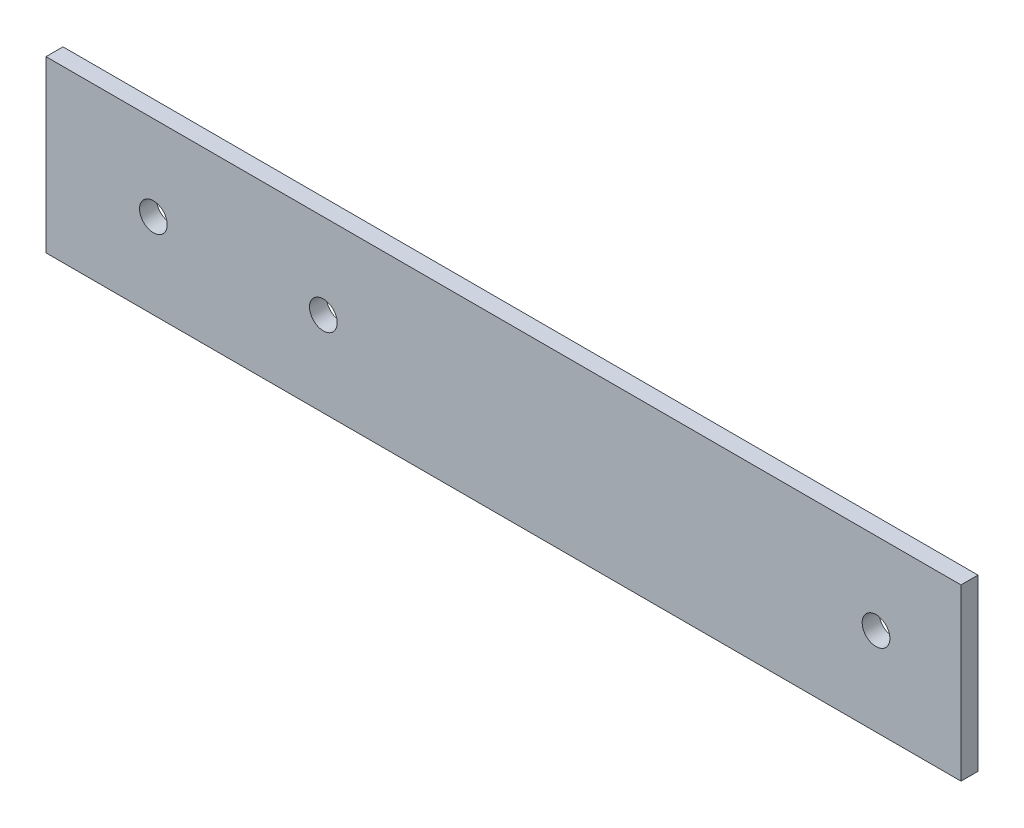
ISO-10303-21;
HEADER;
FILE_DESCRIPTION(('STEP AP214'),'2;1');
FILE_NAME('part.step','',(''),(''),'','','');
FILE_SCHEMA(('AUTOMOTIVE_DESIGN { 1 0 10303 214 1 1 1 1 }'));
ENDSEC;
DATA;
#1=APPLICATION_CONTEXT('core data for automotive mechanical design processes');
#2=APPLICATION_PROTOCOL_DEFINITION('international standard','automotive_design',2000,#1);
#3=PRODUCT_CONTEXT('',#1,'mechanical');
#4=PRODUCT('Part','Part','',(#3));
#5=PRODUCT_RELATED_PRODUCT_CATEGORY('part','',(#4));
#6=PRODUCT_DEFINITION_FORMATION('','',#4);
#7=PRODUCT_DEFINITION_CONTEXT('part definition',#1,'design');
#8=PRODUCT_DEFINITION('design','',#6,#7);
#9=PRODUCT_DEFINITION_SHAPE('','',#8);
#10=(LENGTH_UNIT() NAMED_UNIT(*) SI_UNIT(.MILLI.,.METRE.));
#11=(NAMED_UNIT(*) PLANE_ANGLE_UNIT() SI_UNIT($,.RADIAN.));
#12=(NAMED_UNIT(*) SI_UNIT($,.STERADIAN.) SOLID_ANGLE_UNIT());
#13=UNCERTAINTY_MEASURE_WITH_UNIT(LENGTH_MEASURE(1.E-05),#10,'distance_accuracy_value','');
#14=(GEOMETRIC_REPRESENTATION_CONTEXT(3) GLOBAL_UNCERTAINTY_ASSIGNED_CONTEXT((#13)) GLOBAL_UNIT_ASSIGNED_CONTEXT((#10,
#11,#12)) REPRESENTATION_CONTEXT('',''));
#15=CARTESIAN_POINT('',(0.,0.,0.));
#16=DIRECTION('',(0.,0.,1.));
#17=DIRECTION('',(1.,0.,0.));
#18=AXIS2_PLACEMENT_3D('',#15,#16,#17);
#19=CARTESIAN_POINT('',(0.,0.,2.54));
#20=DIRECTION('',(0.,0.,-1.));
#21=DIRECTION('',(-1.,0.,0.));
#22=AXIS2_PLACEMENT_3D('',#19,#20,#21);
#23=PLANE('',#22);
#24=DIRECTION('',(-1.,0.,0.));
#25=VECTOR('',#24,1.);
#26=CARTESIAN_POINT('',(-118.938398372896,202.301133888924,2.54));
#27=LINE('',#26,#25);
#28=CARTESIAN_POINT('',(17.7896282413869,202.301133888924,2.54));
#29=VERTEX_POINT('',#28);
#30=CARTESIAN_POINT('',(-118.938398372896,202.301133888924,2.54));
#31=VERTEX_POINT('',#30);
#32=EDGE_CURVE('E85',#29,#31,#27,.T.);
#33=ORIENTED_EDGE('',*,*,#32,.T.);
#34=DIRECTION('',(0.,-1.,0.));
#35=VECTOR('',#34,1.);
#36=CARTESIAN_POINT('',(-118.938398372896,176.901133888924,2.54));
#37=LINE('',#36,#35);
#38=CARTESIAN_POINT('',(-118.938398372896,176.901133888924,2.54));
#39=VERTEX_POINT('',#38);
#40=EDGE_CURVE('E80',#31,#39,#37,.T.);
#41=ORIENTED_EDGE('',*,*,#40,.T.);
#42=DIRECTION('',(1.,0.,0.));
#43=VECTOR('',#42,1.);
#44=CARTESIAN_POINT('',(17.7896282413869,176.901133888924,2.54));
#45=LINE('',#44,#43);
#46=CARTESIAN_POINT('',(17.7896282413869,176.901133888924,2.54));
#47=VERTEX_POINT('',#46);
#48=EDGE_CURVE('E83',#39,#47,#45,.T.);
#49=ORIENTED_EDGE('',*,*,#48,.T.);
#50=DIRECTION('',(0.,1.,0.));
#51=VECTOR('',#50,1.);
#52=CARTESIAN_POINT('',(17.7896282413869,202.301133888924,2.54));
#53=LINE('',#52,#51);
#54=EDGE_CURVE('E50',#47,#29,#53,.T.);
#55=ORIENTED_EDGE('',*,*,#54,.T.);
#56=EDGE_LOOP('',(#33,#41,#49,#55));
#57=FACE_BOUND('',#56,.T.);
#58=CARTESIAN_POINT('',(5.0896273733908,190.042706089712,2.54));
#59=DIRECTION('',(0.,0.,1.));
#60=DIRECTION('',(1.,0.,0.));
#61=AXIS2_PLACEMENT_3D('',#58,#59,#60);
#62=CIRCLE('',#61,2.07009999999997);
#63=CARTESIAN_POINT('',(7.15972737339078,190.042706089712,2.54));
#64=VERTEX_POINT('',#63);
#65=EDGE_CURVE('E100',#64,#64,#62,.T.);
#66=ORIENTED_EDGE('',*,*,#65,.F.);
#67=EDGE_LOOP('',(#66));
#68=FACE_BOUND('',#67,.T.);
#69=CARTESIAN_POINT('',(-77.4929304558526,189.601133897075,2.54));
#70=DIRECTION('',(0.,0.,1.));
#71=DIRECTION('',(1.,0.,0.));
#72=AXIS2_PLACEMENT_3D('',#69,#70,#71);
#73=CIRCLE('',#72,2.07009999999998);
#74=CARTESIAN_POINT('',(-75.4228304558527,189.601133897075,2.54));
#75=VERTEX_POINT('',#74);
#76=EDGE_CURVE('E115',#75,#75,#73,.T.);
#77=ORIENTED_EDGE('',*,*,#76,.F.);
#78=EDGE_LOOP('',(#77));
#79=FACE_BOUND('',#78,.T.);
#80=CARTESIAN_POINT('',(-102.892930455853,189.601133897059,2.54));
#81=DIRECTION('',(0.,0.,1.));
#82=DIRECTION('',(1.,0.,0.));
#83=AXIS2_PLACEMENT_3D('',#80,#81,#82);
#84=CIRCLE('',#83,2.07009999999998);
#85=CARTESIAN_POINT('',(-100.822830455853,189.601133897059,2.54));
#86=VERTEX_POINT('',#85);
#87=EDGE_CURVE('E121',#86,#86,#84,.T.);
#88=ORIENTED_EDGE('',*,*,#87,.F.);
#89=EDGE_LOOP('',(#88));
#90=FACE_BOUND('',#89,.T.);
#91=ADVANCED_FACE('F33',(#57,#68,#79,#90),#23,.F.);
#92=CARTESIAN_POINT('',(0.,0.,0.));
#93=DIRECTION('',(0.,0.,-1.));
#94=DIRECTION('',(-1.,0.,0.));
#95=AXIS2_PLACEMENT_3D('',#92,#93,#94);
#96=PLANE('',#95);
#97=CARTESIAN_POINT('',(-77.4929304558526,189.601133897075,0.));
#98=DIRECTION('',(0.,0.,1.));
#99=DIRECTION('',(1.,0.,0.));
#100=AXIS2_PLACEMENT_3D('',#97,#98,#99);
#101=CIRCLE('',#100,2.07009999999998);
#102=CARTESIAN_POINT('',(-75.4228304558527,189.601133897075,0.));
#103=VERTEX_POINT('',#102);
#104=EDGE_CURVE('E118',#103,#103,#101,.T.);
#105=ORIENTED_EDGE('',*,*,#104,.T.);
#106=EDGE_LOOP('',(#105));
#107=FACE_BOUND('',#106,.T.);
#108=DIRECTION('',(-1.,0.,0.));
#109=VECTOR('',#108,1.);
#110=CARTESIAN_POINT('',(-118.938398372896,202.301133888924,0.));
#111=LINE('',#110,#109);
#112=CARTESIAN_POINT('',(17.7896282413869,202.301133888924,0.));
#113=VERTEX_POINT('',#112);
#114=CARTESIAN_POINT('',(-118.938398372896,202.301133888924,0.));
#115=VERTEX_POINT('',#114);
#116=EDGE_CURVE('E97',#113,#115,#111,.T.);
#117=ORIENTED_EDGE('',*,*,#116,.F.);
#118=DIRECTION('',(0.,1.,0.));
#119=VECTOR('',#118,1.);
#120=CARTESIAN_POINT('',(17.7896282413869,202.301133888924,0.));
#121=LINE('',#120,#119);
#122=CARTESIAN_POINT('',(17.7896282413869,176.901133888924,0.));
#123=VERTEX_POINT('',#122);
#124=EDGE_CURVE('E73',#123,#113,#121,.T.);
#125=ORIENTED_EDGE('',*,*,#124,.F.);
#126=DIRECTION('',(1.,0.,0.));
#127=VECTOR('',#126,1.);
#128=CARTESIAN_POINT('',(17.7896282413869,176.901133888924,0.));
#129=LINE('',#128,#127);
#130=CARTESIAN_POINT('',(-118.938398372896,176.901133888924,0.));
#131=VERTEX_POINT('',#130);
#132=EDGE_CURVE('E67',#131,#123,#129,.T.);
#133=ORIENTED_EDGE('',*,*,#132,.F.);
#134=DIRECTION('',(0.,-1.,0.));
#135=VECTOR('',#134,1.);
#136=CARTESIAN_POINT('',(-118.938398372896,176.901133888924,0.));
#137=LINE('',#136,#135);
#138=EDGE_CURVE('E89',#115,#131,#137,.T.);
#139=ORIENTED_EDGE('',*,*,#138,.F.);
#140=EDGE_LOOP('',(#117,#125,#133,#139));
#141=FACE_BOUND('',#140,.T.);
#142=CARTESIAN_POINT('',(5.0896273733908,190.042706089712,0.));
#143=DIRECTION('',(0.,0.,1.));
#144=DIRECTION('',(1.,0.,0.));
#145=AXIS2_PLACEMENT_3D('',#142,#143,#144);
#146=CIRCLE('',#145,2.07009999999997);
#147=CARTESIAN_POINT('',(7.15972737339078,190.042706089712,0.));
#148=VERTEX_POINT('',#147);
#149=EDGE_CURVE('E112',#148,#148,#146,.T.);
#150=ORIENTED_EDGE('',*,*,#149,.T.);
#151=EDGE_LOOP('',(#150));
#152=FACE_BOUND('',#151,.T.);
#153=CARTESIAN_POINT('',(-102.892930455853,189.601133897059,0.));
#154=DIRECTION('',(0.,0.,1.));
#155=DIRECTION('',(1.,0.,0.));
#156=AXIS2_PLACEMENT_3D('',#153,#154,#155);
#157=CIRCLE('',#156,2.07009999999998);
#158=CARTESIAN_POINT('',(-100.822830455853,189.601133897059,0.));
#159=VERTEX_POINT('',#158);
#160=EDGE_CURVE('E124',#159,#159,#157,.T.);
#161=ORIENTED_EDGE('',*,*,#160,.T.);
#162=EDGE_LOOP('',(#161));
#163=FACE_BOUND('',#162,.T.);
#164=ADVANCED_FACE('F108',(#107,#141,#152,#163),#96,.T.);
#165=CARTESIAN_POINT('',(-118.938398372896,202.301133888924,2.54));
#166=DIRECTION('',(0.,-1.,0.));
#167=DIRECTION('',(0.,0.,-1.));
#168=AXIS2_PLACEMENT_3D('',#165,#166,#167);
#169=PLANE('',#168);
#170=ORIENTED_EDGE('',*,*,#116,.T.);
#171=DIRECTION('',(0.,0.,-1.));
#172=VECTOR('',#171,1.);
#173=CARTESIAN_POINT('',(-118.938398372896,202.301133888924,2.54));
#174=LINE('',#173,#172);
#175=EDGE_CURVE('E11',#31,#115,#174,.T.);
#176=ORIENTED_EDGE('',*,*,#175,.F.);
#177=ORIENTED_EDGE('',*,*,#32,.F.);
#178=DIRECTION('',(0.,0.,-1.));
#179=VECTOR('',#178,1.);
#180=CARTESIAN_POINT('',(17.7896282413869,202.301133888924,2.54));
#181=LINE('',#180,#179);
#182=EDGE_CURVE('E93',#29,#113,#181,.T.);
#183=ORIENTED_EDGE('',*,*,#182,.T.);
#184=EDGE_LOOP('',(#170,#176,#177,#183));
#185=FACE_BOUND('',#184,.T.);
#186=ADVANCED_FACE('F35',(#185),#169,.F.);
#187=CARTESIAN_POINT('',(-118.938398372896,176.901133888924,2.54));
#188=DIRECTION('',(1.,0.,0.));
#189=DIRECTION('',(0.,1.,0.));
#190=AXIS2_PLACEMENT_3D('',#187,#188,#189);
#191=PLANE('',#190);
#192=ORIENTED_EDGE('',*,*,#138,.T.);
#193=DIRECTION('',(0.,0.,-1.));
#194=VECTOR('',#193,1.);
#195=CARTESIAN_POINT('',(-118.938398372896,176.901133888924,2.54));
#196=LINE('',#195,#194);
#197=EDGE_CURVE('E42',#39,#131,#196,.T.);
#198=ORIENTED_EDGE('',*,*,#197,.F.);
#199=ORIENTED_EDGE('',*,*,#40,.F.);
#200=ORIENTED_EDGE('',*,*,#175,.T.);
#201=EDGE_LOOP('',(#192,#198,#199,#200));
#202=FACE_BOUND('',#201,.T.);
#203=ADVANCED_FACE('F88',(#202),#191,.F.);
#204=CARTESIAN_POINT('',(17.7896282413869,176.901133888924,2.54));
#205=DIRECTION('',(0.,1.,0.));
#206=DIRECTION('',(-1.,0.,0.));
#207=AXIS2_PLACEMENT_3D('',#204,#205,#206);
#208=PLANE('',#207);
#209=ORIENTED_EDGE('',*,*,#132,.T.);
#210=DIRECTION('',(0.,0.,-1.));
#211=VECTOR('',#210,1.);
#212=CARTESIAN_POINT('',(17.7896282413869,176.901133888924,2.54));
#213=LINE('',#212,#211);
#214=EDGE_CURVE('E90',#47,#123,#213,.T.);
#215=ORIENTED_EDGE('',*,*,#214,.F.);
#216=ORIENTED_EDGE('',*,*,#48,.F.);
#217=ORIENTED_EDGE('',*,*,#197,.T.);
#218=EDGE_LOOP('',(#209,#215,#216,#217));
#219=FACE_BOUND('',#218,.T.);
#220=ADVANCED_FACE('F91',(#219),#208,.F.);
#221=CARTESIAN_POINT('',(17.7896282413869,202.301133888924,2.54));
#222=DIRECTION('',(-1.,0.,0.));
#223=DIRECTION('',(0.,-1.,0.));
#224=AXIS2_PLACEMENT_3D('',#221,#222,#223);
#225=PLANE('',#224);
#226=ORIENTED_EDGE('',*,*,#124,.T.);
#227=ORIENTED_EDGE('',*,*,#182,.F.);
#228=ORIENTED_EDGE('',*,*,#54,.F.);
#229=ORIENTED_EDGE('',*,*,#214,.T.);
#230=EDGE_LOOP('',(#226,#227,#228,#229));
#231=FACE_BOUND('',#230,.T.);
#232=ADVANCED_FACE('F105',(#231),#225,.F.);
#233=CARTESIAN_POINT('',(5.0896273733908,190.042706089712,2.54));
#234=DIRECTION('',(0.,0.,-1.));
#235=DIRECTION('',(-1.,0.,0.));
#236=AXIS2_PLACEMENT_3D('',#233,#234,#235);
#237=CYLINDRICAL_SURFACE('',#236,2.07009999999997);
#238=ORIENTED_EDGE('',*,*,#65,.T.);
#239=EDGE_LOOP('',(#238));
#240=FACE_BOUND('',#239,.T.);
#241=ORIENTED_EDGE('',*,*,#149,.F.);
#242=EDGE_LOOP('',(#241));
#243=FACE_BOUND('',#242,.T.);
#244=ADVANCED_FACE('F141',(#240,#243),#237,.F.);
#245=CARTESIAN_POINT('',(-77.4929304558526,189.601133897075,2.54));
#246=DIRECTION('',(0.,0.,-1.));
#247=DIRECTION('',(-1.,0.,0.));
#248=AXIS2_PLACEMENT_3D('',#245,#246,#247);
#249=CYLINDRICAL_SURFACE('',#248,2.07009999999998);
#250=ORIENTED_EDGE('',*,*,#76,.T.);
#251=EDGE_LOOP('',(#250));
#252=FACE_BOUND('',#251,.T.);
#253=ORIENTED_EDGE('',*,*,#104,.F.);
#254=EDGE_LOOP('',(#253));
#255=FACE_BOUND('',#254,.T.);
#256=ADVANCED_FACE('F187',(#252,#255),#249,.F.);
#257=CARTESIAN_POINT('',(-102.892930455853,189.601133897059,2.54));
#258=DIRECTION('',(0.,0.,-1.));
#259=DIRECTION('',(-1.,0.,0.));
#260=AXIS2_PLACEMENT_3D('',#257,#258,#259);
#261=CYLINDRICAL_SURFACE('',#260,2.07009999999998);
#262=ORIENTED_EDGE('',*,*,#87,.T.);
#263=EDGE_LOOP('',(#262));
#264=FACE_BOUND('',#263,.T.);
#265=ORIENTED_EDGE('',*,*,#160,.F.);
#266=EDGE_LOOP('',(#265));
#267=FACE_BOUND('',#266,.T.);
#268=ADVANCED_FACE('F130',(#264,#267),#261,.F.);
#269=CLOSED_SHELL('',(#91,#164,#186,#203,#220,#232,#244,#256,#268));
#270=MANIFOLD_SOLID_BREP('B2',#269);
#271=ADVANCED_BREP_SHAPE_REPRESENTATION('',(#18,#270),#14);
#272=SHAPE_DEFINITION_REPRESENTATION(#9,#271);
ENDSEC;
END-ISO-10303-21;
